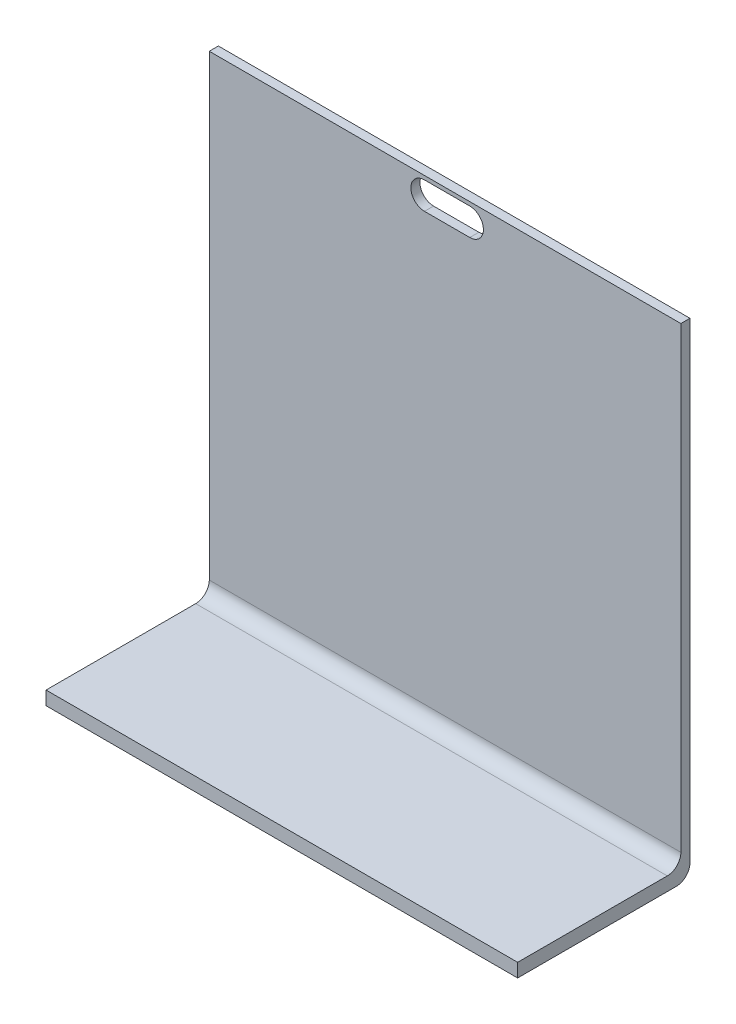
ISO-10303-21;
HEADER;
FILE_DESCRIPTION(('STEP AP214'),'2;1');
FILE_NAME('part.step','',(''),(''),'','','');
FILE_SCHEMA(('AUTOMOTIVE_DESIGN { 1 0 10303 214 1 1 1 1 }'));
ENDSEC;
DATA;
#1=APPLICATION_CONTEXT('core data for automotive mechanical design processes');
#2=APPLICATION_PROTOCOL_DEFINITION('international standard','automotive_design',2000,#1);
#3=PRODUCT_CONTEXT('',#1,'mechanical');
#4=PRODUCT('Part','Part','',(#3));
#5=PRODUCT_RELATED_PRODUCT_CATEGORY('part','',(#4));
#6=PRODUCT_DEFINITION_FORMATION('','',#4);
#7=PRODUCT_DEFINITION_CONTEXT('part definition',#1,'design');
#8=PRODUCT_DEFINITION('design','',#6,#7);
#9=PRODUCT_DEFINITION_SHAPE('','',#8);
#10=(LENGTH_UNIT() NAMED_UNIT(*) SI_UNIT(.MILLI.,.METRE.));
#11=(NAMED_UNIT(*) PLANE_ANGLE_UNIT() SI_UNIT($,.RADIAN.));
#12=(NAMED_UNIT(*) SI_UNIT($,.STERADIAN.) SOLID_ANGLE_UNIT());
#13=UNCERTAINTY_MEASURE_WITH_UNIT(LENGTH_MEASURE(1.E-05),#10,'distance_accuracy_value','');
#14=(GEOMETRIC_REPRESENTATION_CONTEXT(3) GLOBAL_UNCERTAINTY_ASSIGNED_CONTEXT((#13)) GLOBAL_UNIT_ASSIGNED_CONTEXT((#10,
#11,#12)) REPRESENTATION_CONTEXT('',''));
#15=CARTESIAN_POINT('',(0.,0.,0.));
#16=DIRECTION('',(0.,0.,1.));
#17=DIRECTION('',(1.,0.,0.));
#18=AXIS2_PLACEMENT_3D('',#15,#16,#17);
#19=CARTESIAN_POINT('',(52.,3.,-19.));
#20=DIRECTION('',(0.,0.,1.));
#21=DIRECTION('',(1.,0.,0.));
#22=AXIS2_PLACEMENT_3D('',#19,#20,#21);
#23=PLANE('',#22);
#24=DIRECTION('',(0.,-1.,0.));
#25=VECTOR('',#24,1.);
#26=CARTESIAN_POINT('',(52.,3.,-19.));
#27=LINE('',#26,#25);
#28=CARTESIAN_POINT('',(52.,107.,-19.));
#29=VERTEX_POINT('',#28);
#30=CARTESIAN_POINT('',(52.,3.,-19.));
#31=VERTEX_POINT('',#30);
#32=EDGE_CURVE('E207',#29,#31,#27,.T.);
#33=ORIENTED_EDGE('',*,*,#32,.T.);
#34=DIRECTION('',(-1.,0.,0.));
#35=VECTOR('',#34,1.);
#36=CARTESIAN_POINT('',(52.,3.,-19.));
#37=LINE('',#36,#35);
#38=CARTESIAN_POINT('',(-52.,3.,-19.));
#39=VERTEX_POINT('',#38);
#40=EDGE_CURVE('E219',#31,#39,#37,.T.);
#41=ORIENTED_EDGE('',*,*,#40,.T.);
#42=DIRECTION('',(0.,-1.,0.));
#43=VECTOR('',#42,1.);
#44=CARTESIAN_POINT('',(-52.,3.,-19.));
#45=LINE('',#44,#43);
#46=CARTESIAN_POINT('',(-52.,107.,-19.));
#47=VERTEX_POINT('',#46);
#48=EDGE_CURVE('E195',#47,#39,#45,.T.);
#49=ORIENTED_EDGE('',*,*,#48,.F.);
#50=DIRECTION('',(-1.,0.,0.));
#51=VECTOR('',#50,1.);
#52=CARTESIAN_POINT('',(52.,107.,-19.));
#53=LINE('',#52,#51);
#54=EDGE_CURVE('E165',#29,#47,#53,.T.);
#55=ORIENTED_EDGE('',*,*,#54,.F.);
#56=EDGE_LOOP('',(#33,#41,#49,#55));
#57=FACE_BOUND('',#56,.T.);
#58=DIRECTION('',(-1.,0.,0.));
#59=VECTOR('',#58,1.);
#60=CARTESIAN_POINT('',(5.45208961720016,106.154609434962,-19.));
#61=LINE('',#60,#59);
#62=CARTESIAN_POINT('',(5.45208961720016,106.154609434962,-19.));
#63=VERTEX_POINT('',#62);
#64=CARTESIAN_POINT('',(-4.54377885134702,106.154609434962,-19.));
#65=VERTEX_POINT('',#64);
#66=EDGE_CURVE('E54',#63,#65,#61,.T.);
#67=ORIENTED_EDGE('',*,*,#66,.T.);
#68=CARTESIAN_POINT('',(-4.54377885134702,103.154609434962,-19.));
#69=DIRECTION('',(0.,0.,-1.));
#70=DIRECTION('',(-1.,0.,0.));
#71=AXIS2_PLACEMENT_3D('',#68,#69,#70);
#72=CIRCLE('',#71,3.);
#73=CARTESIAN_POINT('',(-4.54377885134702,100.154609434962,-19.));
#74=VERTEX_POINT('',#73);
#75=EDGE_CURVE('E137',#74,#65,#72,.T.);
#76=ORIENTED_EDGE('',*,*,#75,.F.);
#77=DIRECTION('',(-1.,0.,0.));
#78=VECTOR('',#77,1.);
#79=CARTESIAN_POINT('',(5.45208961720016,100.154609434962,-19.));
#80=LINE('',#79,#78);
#81=CARTESIAN_POINT('',(5.45208961720016,100.154609434962,-19.));
#82=VERTEX_POINT('',#81);
#83=EDGE_CURVE('E144',#82,#74,#80,.T.);
#84=ORIENTED_EDGE('',*,*,#83,.F.);
#85=CARTESIAN_POINT('',(5.45208961720016,103.154609434962,-19.));
#86=DIRECTION('',(0.,0.,-1.));
#87=DIRECTION('',(-1.,0.,0.));
#88=AXIS2_PLACEMENT_3D('',#85,#86,#87);
#89=CIRCLE('',#88,3.);
#90=EDGE_CURVE('E147',#63,#82,#89,.T.);
#91=ORIENTED_EDGE('',*,*,#90,.F.);
#92=EDGE_LOOP('',(#67,#76,#84,#91));
#93=FACE_BOUND('',#92,.T.);
#94=ADVANCED_FACE('F38',(#57,#93),#23,.F.);
#95=CARTESIAN_POINT('',(52.,107.,-17.));
#96=DIRECTION('',(0.,0.,-1.));
#97=DIRECTION('',(-1.,0.,0.));
#98=AXIS2_PLACEMENT_3D('',#95,#96,#97);
#99=PLANE('',#98);
#100=DIRECTION('',(0.,-1.,0.));
#101=VECTOR('',#100,1.);
#102=CARTESIAN_POINT('',(-52.,107.,-17.));
#103=LINE('',#102,#101);
#104=CARTESIAN_POINT('',(-52.,107.,-17.));
#105=VERTEX_POINT('',#104);
#106=CARTESIAN_POINT('',(-52.,6.00000000000003,-17.));
#107=VERTEX_POINT('',#106);
#108=EDGE_CURVE('E179',#105,#107,#103,.T.);
#109=ORIENTED_EDGE('',*,*,#108,.T.);
#110=DIRECTION('',(1.,0.,0.));
#111=VECTOR('',#110,1.);
#112=CARTESIAN_POINT('',(52.,6.00000000000001,-17.));
#113=LINE('',#112,#111);
#114=CARTESIAN_POINT('',(52.,6.00000000000003,-17.));
#115=VERTEX_POINT('',#114);
#116=EDGE_CURVE('E232',#107,#115,#113,.T.);
#117=ORIENTED_EDGE('',*,*,#116,.T.);
#118=DIRECTION('',(0.,-1.,0.));
#119=VECTOR('',#118,1.);
#120=CARTESIAN_POINT('',(52.,107.,-17.));
#121=LINE('',#120,#119);
#122=CARTESIAN_POINT('',(52.,107.,-17.));
#123=VERTEX_POINT('',#122);
#124=EDGE_CURVE('E175',#123,#115,#121,.T.);
#125=ORIENTED_EDGE('',*,*,#124,.F.);
#126=DIRECTION('',(1.,0.,0.));
#127=VECTOR('',#126,1.);
#128=CARTESIAN_POINT('',(52.,107.,-17.));
#129=LINE('',#128,#127);
#130=EDGE_CURVE('E172',#105,#123,#129,.T.);
#131=ORIENTED_EDGE('',*,*,#130,.F.);
#132=EDGE_LOOP('',(#109,#117,#125,#131));
#133=FACE_BOUND('',#132,.T.);
#134=DIRECTION('',(-1.,0.,0.));
#135=VECTOR('',#134,1.);
#136=CARTESIAN_POINT('',(52.,106.154609434962,-17.));
#137=LINE('',#136,#135);
#138=CARTESIAN_POINT('',(5.45208961720016,106.154609434962,-17.));
#139=VERTEX_POINT('',#138);
#140=CARTESIAN_POINT('',(-4.54377885134702,106.154609434962,-17.));
#141=VERTEX_POINT('',#140);
#142=EDGE_CURVE('E11',#139,#141,#137,.T.);
#143=ORIENTED_EDGE('',*,*,#142,.F.);
#144=CARTESIAN_POINT('',(5.45208961720016,103.154609434962,-17.));
#145=DIRECTION('',(0.,0.,-1.));
#146=DIRECTION('',(-1.,0.,0.));
#147=AXIS2_PLACEMENT_3D('',#144,#145,#146);
#148=CIRCLE('',#147,3.);
#149=CARTESIAN_POINT('',(5.45208961720016,100.154609434962,-17.));
#150=VERTEX_POINT('',#149);
#151=EDGE_CURVE('E245',#139,#150,#148,.T.);
#152=ORIENTED_EDGE('',*,*,#151,.T.);
#153=DIRECTION('',(-1.,0.,0.));
#154=VECTOR('',#153,1.);
#155=CARTESIAN_POINT('',(52.,100.154609434962,-17.));
#156=LINE('',#155,#154);
#157=CARTESIAN_POINT('',(-4.54377885134702,100.154609434962,-17.));
#158=VERTEX_POINT('',#157);
#159=EDGE_CURVE('E249',#150,#158,#156,.T.);
#160=ORIENTED_EDGE('',*,*,#159,.T.);
#161=CARTESIAN_POINT('',(-4.54377885134702,103.154609434962,-17.));
#162=DIRECTION('',(0.,0.,-1.));
#163=DIRECTION('',(-1.,0.,0.));
#164=AXIS2_PLACEMENT_3D('',#161,#162,#163);
#165=CIRCLE('',#164,3.);
#166=EDGE_CURVE('E47',#158,#141,#165,.T.);
#167=ORIENTED_EDGE('',*,*,#166,.T.);
#168=EDGE_LOOP('',(#143,#152,#160,#167));
#169=FACE_BOUND('',#168,.T.);
#170=ADVANCED_FACE('F254',(#133,#169),#99,.F.);
#171=CARTESIAN_POINT('',(-52.,3.,19.));
#172=DIRECTION('',(1.,0.,0.));
#173=DIRECTION('',(0.,0.,-1.));
#174=AXIS2_PLACEMENT_3D('',#171,#172,#173);
#175=PLANE('',#174);
#176=ORIENTED_EDGE('',*,*,#48,.T.);
#177=CARTESIAN_POINT('',(-52.,3.,-16.));
#178=DIRECTION('',(1.,0.,0.));
#179=DIRECTION('',(0.,0.,-1.));
#180=AXIS2_PLACEMENT_3D('',#177,#178,#179);
#181=CIRCLE('',#180,3.);
#182=CARTESIAN_POINT('',(-52.,0.,-16.));
#183=VERTEX_POINT('',#182);
#184=EDGE_CURVE('E223',#39,#183,#181,.F.);
#185=ORIENTED_EDGE('',*,*,#184,.T.);
#186=DIRECTION('',(0.,0.,1.));
#187=VECTOR('',#186,1.);
#188=CARTESIAN_POINT('',(-52.,0.,19.));
#189=LINE('',#188,#187);
#190=CARTESIAN_POINT('',(-52.,0.,19.));
#191=VERTEX_POINT('',#190);
#192=EDGE_CURVE('E183',#183,#191,#189,.T.);
#193=ORIENTED_EDGE('',*,*,#192,.T.);
#194=DIRECTION('',(0.,-1.,0.));
#195=VECTOR('',#194,1.);
#196=CARTESIAN_POINT('',(-52.,3.,19.));
#197=LINE('',#196,#195);
#198=CARTESIAN_POINT('',(-52.,3.,19.));
#199=VERTEX_POINT('',#198);
#200=EDGE_CURVE('E215',#199,#191,#197,.T.);
#201=ORIENTED_EDGE('',*,*,#200,.F.);
#202=DIRECTION('',(0.,0.,1.));
#203=VECTOR('',#202,1.);
#204=CARTESIAN_POINT('',(-52.,3.,19.));
#205=LINE('',#204,#203);
#206=CARTESIAN_POINT('',(-52.,3.,-14.));
#207=VERTEX_POINT('',#206);
#208=EDGE_CURVE('E184',#207,#199,#205,.T.);
#209=ORIENTED_EDGE('',*,*,#208,.F.);
#210=CARTESIAN_POINT('',(-52.,6.00000000000001,-14.));
#211=DIRECTION('',(1.,0.,0.));
#212=DIRECTION('',(0.,0.,-1.));
#213=AXIS2_PLACEMENT_3D('',#210,#211,#212);
#214=CIRCLE('',#213,3.);
#215=EDGE_CURVE('E242',#207,#107,#214,.T.);
#216=ORIENTED_EDGE('',*,*,#215,.T.);
#217=ORIENTED_EDGE('',*,*,#108,.F.);
#218=DIRECTION('',(0.,0.,1.));
#219=VECTOR('',#218,1.);
#220=CARTESIAN_POINT('',(-52.,107.,-19.));
#221=LINE('',#220,#219);
#222=EDGE_CURVE('E169',#47,#105,#221,.T.);
#223=ORIENTED_EDGE('',*,*,#222,.F.);
#224=EDGE_LOOP('',(#176,#185,#193,#201,#209,#216,#217,#223));
#225=FACE_BOUND('',#224,.T.);
#226=ADVANCED_FACE('F271',(#225),#175,.F.);
#227=CARTESIAN_POINT('',(52.,3.,19.));
#228=DIRECTION('',(0.,0.,-1.));
#229=DIRECTION('',(-1.,0.,0.));
#230=AXIS2_PLACEMENT_3D('',#227,#228,#229);
#231=PLANE('',#230);
#232=DIRECTION('',(1.,0.,0.));
#233=VECTOR('',#232,1.);
#234=CARTESIAN_POINT('',(52.,0.,19.));
#235=LINE('',#234,#233);
#236=CARTESIAN_POINT('',(52.,0.,19.));
#237=VERTEX_POINT('',#236);
#238=EDGE_CURVE('E198',#191,#237,#235,.T.);
#239=ORIENTED_EDGE('',*,*,#238,.T.);
#240=DIRECTION('',(0.,-1.,0.));
#241=VECTOR('',#240,1.);
#242=CARTESIAN_POINT('',(52.,3.,19.));
#243=LINE('',#242,#241);
#244=CARTESIAN_POINT('',(52.,3.,19.));
#245=VERTEX_POINT('',#244);
#246=EDGE_CURVE('E211',#245,#237,#243,.T.);
#247=ORIENTED_EDGE('',*,*,#246,.F.);
#248=DIRECTION('',(1.,0.,0.));
#249=VECTOR('',#248,1.);
#250=CARTESIAN_POINT('',(52.,3.,19.));
#251=LINE('',#250,#249);
#252=EDGE_CURVE('E187',#199,#245,#251,.T.);
#253=ORIENTED_EDGE('',*,*,#252,.F.);
#254=ORIENTED_EDGE('',*,*,#200,.T.);
#255=EDGE_LOOP('',(#239,#247,#253,#254));
#256=FACE_BOUND('',#255,.T.);
#257=ADVANCED_FACE('F282',(#256),#231,.F.);
#258=CARTESIAN_POINT('',(52.,3.,19.));
#259=DIRECTION('',(-1.,0.,0.));
#260=DIRECTION('',(0.,0.,1.));
#261=AXIS2_PLACEMENT_3D('',#258,#259,#260);
#262=PLANE('',#261);
#263=DIRECTION('',(0.,0.,-1.));
#264=VECTOR('',#263,1.);
#265=CARTESIAN_POINT('',(52.,0.,19.));
#266=LINE('',#265,#264);
#267=CARTESIAN_POINT('',(52.,0.,-16.));
#268=VERTEX_POINT('',#267);
#269=EDGE_CURVE('E188',#237,#268,#266,.T.);
#270=ORIENTED_EDGE('',*,*,#269,.T.);
#271=CARTESIAN_POINT('',(52.,3.,-16.));
#272=DIRECTION('',(-1.,0.,0.));
#273=DIRECTION('',(0.,0.,1.));
#274=AXIS2_PLACEMENT_3D('',#271,#272,#273);
#275=CIRCLE('',#274,3.);
#276=EDGE_CURVE('E229',#268,#31,#275,.F.);
#277=ORIENTED_EDGE('',*,*,#276,.T.);
#278=ORIENTED_EDGE('',*,*,#32,.F.);
#279=DIRECTION('',(0.,0.,-1.));
#280=VECTOR('',#279,1.);
#281=CARTESIAN_POINT('',(52.,107.,-19.));
#282=LINE('',#281,#280);
#283=EDGE_CURVE('E133',#123,#29,#282,.T.);
#284=ORIENTED_EDGE('',*,*,#283,.F.);
#285=ORIENTED_EDGE('',*,*,#124,.T.);
#286=CARTESIAN_POINT('',(52.,6.00000000000001,-14.));
#287=DIRECTION('',(-1.,0.,0.));
#288=DIRECTION('',(0.,0.,1.));
#289=AXIS2_PLACEMENT_3D('',#286,#287,#288);
#290=CIRCLE('',#289,3.);
#291=CARTESIAN_POINT('',(52.,3.,-14.));
#292=VERTEX_POINT('',#291);
#293=EDGE_CURVE('E239',#115,#292,#290,.T.);
#294=ORIENTED_EDGE('',*,*,#293,.T.);
#295=DIRECTION('',(0.,0.,-1.));
#296=VECTOR('',#295,1.);
#297=CARTESIAN_POINT('',(52.,3.,19.));
#298=LINE('',#297,#296);
#299=EDGE_CURVE('E191',#245,#292,#298,.T.);
#300=ORIENTED_EDGE('',*,*,#299,.F.);
#301=ORIENTED_EDGE('',*,*,#246,.T.);
#302=EDGE_LOOP('',(#270,#277,#278,#284,#285,#294,#300,#301));
#303=FACE_BOUND('',#302,.T.);
#304=ADVANCED_FACE('F278',(#303),#262,.F.);
#305=CARTESIAN_POINT('',(0.,3.,0.));
#306=DIRECTION('',(0.,1.,0.));
#307=DIRECTION('',(0.,0.,1.));
#308=AXIS2_PLACEMENT_3D('',#305,#306,#307);
#309=PLANE('',#308);
#310=ORIENTED_EDGE('',*,*,#299,.T.);
#311=DIRECTION('',(1.,0.,0.));
#312=VECTOR('',#311,1.);
#313=CARTESIAN_POINT('',(0.,3.,-14.));
#314=LINE('',#313,#312);
#315=EDGE_CURVE('E236',#292,#207,#314,.F.);
#316=ORIENTED_EDGE('',*,*,#315,.T.);
#317=ORIENTED_EDGE('',*,*,#208,.T.);
#318=ORIENTED_EDGE('',*,*,#252,.T.);
#319=EDGE_LOOP('',(#310,#316,#317,#318));
#320=FACE_BOUND('',#319,.T.);
#321=ADVANCED_FACE('F281',(#320),#309,.T.);
#322=CARTESIAN_POINT('',(0.,0.,0.));
#323=DIRECTION('',(0.,1.,0.));
#324=DIRECTION('',(0.,0.,1.));
#325=AXIS2_PLACEMENT_3D('',#322,#323,#324);
#326=PLANE('',#325);
#327=ORIENTED_EDGE('',*,*,#192,.F.);
#328=DIRECTION('',(-1.,0.,0.));
#329=VECTOR('',#328,1.);
#330=CARTESIAN_POINT('',(0.,0.,-16.));
#331=LINE('',#330,#329);
#332=EDGE_CURVE('E226',#183,#268,#331,.F.);
#333=ORIENTED_EDGE('',*,*,#332,.T.);
#334=ORIENTED_EDGE('',*,*,#269,.F.);
#335=ORIENTED_EDGE('',*,*,#238,.F.);
#336=EDGE_LOOP('',(#327,#333,#334,#335));
#337=FACE_BOUND('',#336,.T.);
#338=ADVANCED_FACE('F276',(#337),#326,.F.);
#339=CARTESIAN_POINT('',(0.,107.,0.));
#340=DIRECTION('',(0.,-1.,0.));
#341=DIRECTION('',(0.,0.,-1.));
#342=AXIS2_PLACEMENT_3D('',#339,#340,#341);
#343=PLANE('',#342);
#344=ORIENTED_EDGE('',*,*,#283,.T.);
#345=ORIENTED_EDGE('',*,*,#54,.T.);
#346=ORIENTED_EDGE('',*,*,#222,.T.);
#347=ORIENTED_EDGE('',*,*,#130,.T.);
#348=EDGE_LOOP('',(#344,#345,#346,#347));
#349=FACE_BOUND('',#348,.T.);
#350=ADVANCED_FACE('F291',(#349),#343,.F.);
#351=CARTESIAN_POINT('',(52.,3.,-16.));
#352=DIRECTION('',(-1.,0.,0.));
#353=DIRECTION('',(0.,0.,1.));
#354=AXIS2_PLACEMENT_3D('',#351,#352,#353);
#355=CYLINDRICAL_SURFACE('',#354,3.);
#356=ORIENTED_EDGE('',*,*,#276,.F.);
#357=ORIENTED_EDGE('',*,*,#332,.F.);
#358=ORIENTED_EDGE('',*,*,#184,.F.);
#359=ORIENTED_EDGE('',*,*,#40,.F.);
#360=EDGE_LOOP('',(#356,#357,#358,#359));
#361=FACE_BOUND('',#360,.T.);
#362=ADVANCED_FACE('F289',(#361),#355,.T.);
#363=CARTESIAN_POINT('',(52.,6.00000000000001,-14.));
#364=DIRECTION('',(1.,0.,0.));
#365=DIRECTION('',(0.,0.,-1.));
#366=AXIS2_PLACEMENT_3D('',#363,#364,#365);
#367=CYLINDRICAL_SURFACE('',#366,3.);
#368=ORIENTED_EDGE('',*,*,#215,.F.);
#369=ORIENTED_EDGE('',*,*,#315,.F.);
#370=ORIENTED_EDGE('',*,*,#293,.F.);
#371=ORIENTED_EDGE('',*,*,#116,.F.);
#372=EDGE_LOOP('',(#368,#369,#370,#371));
#373=FACE_BOUND('',#372,.T.);
#374=ADVANCED_FACE('F40',(#373),#367,.F.);
#375=CARTESIAN_POINT('',(5.45208961720016,106.154609434962,19.));
#376=DIRECTION('',(0.,-1.,0.));
#377=DIRECTION('',(0.,0.,-1.));
#378=AXIS2_PLACEMENT_3D('',#375,#376,#377);
#379=PLANE('',#378);
#380=ORIENTED_EDGE('',*,*,#142,.T.);
#381=DIRECTION('',(0.,0.,-1.));
#382=VECTOR('',#381,1.);
#383=CARTESIAN_POINT('',(-4.54377885134701,106.154609434962,19.));
#384=LINE('',#383,#382);
#385=EDGE_CURVE('E126',#141,#65,#384,.T.);
#386=ORIENTED_EDGE('',*,*,#385,.T.);
#387=ORIENTED_EDGE('',*,*,#66,.F.);
#388=DIRECTION('',(0.,0.,-1.));
#389=VECTOR('',#388,1.);
#390=CARTESIAN_POINT('',(5.45208961720016,106.154609434962,19.));
#391=LINE('',#390,#389);
#392=EDGE_CURVE('E155',#139,#63,#391,.T.);
#393=ORIENTED_EDGE('',*,*,#392,.F.);
#394=EDGE_LOOP('',(#380,#386,#387,#393));
#395=FACE_BOUND('',#394,.T.);
#396=ADVANCED_FACE('F128',(#395),#379,.T.);
#397=CARTESIAN_POINT('',(-4.54377885134701,103.154609434962,19.));
#398=DIRECTION('',(0.,0.,-1.));
#399=DIRECTION('',(-1.,0.,0.));
#400=AXIS2_PLACEMENT_3D('',#397,#398,#399);
#401=CYLINDRICAL_SURFACE('',#400,3.);
#402=DIRECTION('',(0.,0.,-1.));
#403=VECTOR('',#402,1.);
#404=CARTESIAN_POINT('',(-4.54377885134702,100.154609434962,19.));
#405=LINE('',#404,#403);
#406=EDGE_CURVE('E134',#158,#74,#405,.T.);
#407=ORIENTED_EDGE('',*,*,#406,.T.);
#408=ORIENTED_EDGE('',*,*,#75,.T.);
#409=ORIENTED_EDGE('',*,*,#385,.F.);
#410=ORIENTED_EDGE('',*,*,#166,.F.);
#411=EDGE_LOOP('',(#407,#408,#409,#410));
#412=FACE_BOUND('',#411,.T.);
#413=ADVANCED_FACE('F138',(#412),#401,.F.);
#414=CARTESIAN_POINT('',(5.45208961720016,100.154609434962,19.));
#415=DIRECTION('',(0.,-1.,0.));
#416=DIRECTION('',(0.,0.,-1.));
#417=AXIS2_PLACEMENT_3D('',#414,#415,#416);
#418=PLANE('',#417);
#419=DIRECTION('',(0.,0.,-1.));
#420=VECTOR('',#419,1.);
#421=CARTESIAN_POINT('',(5.45208961720017,100.154609434962,19.));
#422=LINE('',#421,#420);
#423=EDGE_CURVE('E62',#150,#82,#422,.T.);
#424=ORIENTED_EDGE('',*,*,#423,.T.);
#425=ORIENTED_EDGE('',*,*,#83,.T.);
#426=ORIENTED_EDGE('',*,*,#406,.F.);
#427=ORIENTED_EDGE('',*,*,#159,.F.);
#428=EDGE_LOOP('',(#424,#425,#426,#427));
#429=FACE_BOUND('',#428,.T.);
#430=ADVANCED_FACE('F256',(#429),#418,.F.);
#431=CARTESIAN_POINT('',(5.45208961720016,103.154609434962,19.));
#432=DIRECTION('',(0.,0.,-1.));
#433=DIRECTION('',(-1.,0.,0.));
#434=AXIS2_PLACEMENT_3D('',#431,#432,#433);
#435=CYLINDRICAL_SURFACE('',#434,3.);
#436=ORIENTED_EDGE('',*,*,#392,.T.);
#437=ORIENTED_EDGE('',*,*,#90,.T.);
#438=ORIENTED_EDGE('',*,*,#423,.F.);
#439=ORIENTED_EDGE('',*,*,#151,.F.);
#440=EDGE_LOOP('',(#436,#437,#438,#439));
#441=FACE_BOUND('',#440,.T.);
#442=ADVANCED_FACE('F257',(#441),#435,.F.);
#443=CLOSED_SHELL('',(#94,#170,#226,#257,#304,#321,#338,#350,#362,#374,#396,#413,#430,#442));
#444=MANIFOLD_SOLID_BREP('B2',#443);
#445=ADVANCED_BREP_SHAPE_REPRESENTATION('',(#18,#444),#14);
#446=SHAPE_DEFINITION_REPRESENTATION(#9,#445);
ENDSEC;
END-ISO-10303-21;
